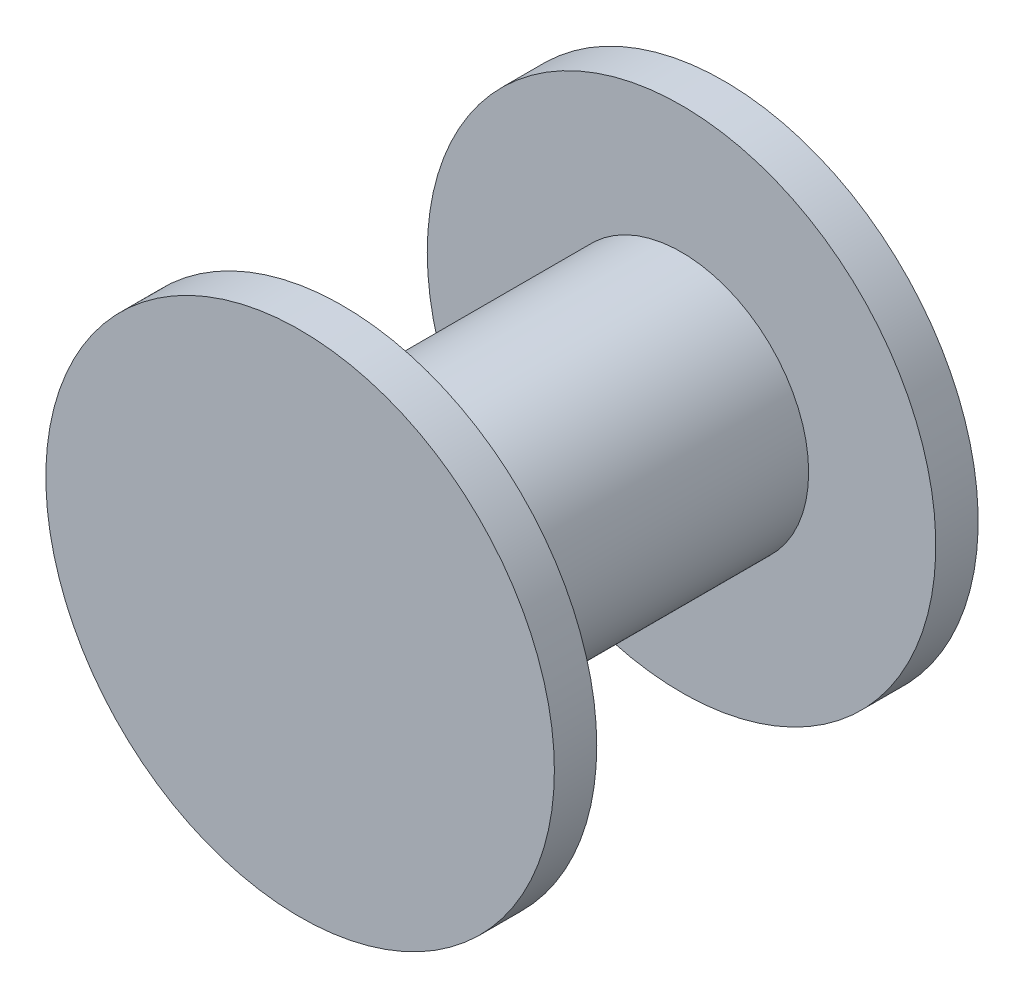
ISO-10303-21;
HEADER;
FILE_DESCRIPTION(('STEP AP214'),'2;1');
FILE_NAME('part.step','',(''),(''),'','','');
FILE_SCHEMA(('AUTOMOTIVE_DESIGN { 1 0 10303 214 1 1 1 1 }'));
ENDSEC;
DATA;
#1=APPLICATION_CONTEXT('core data for automotive mechanical design processes');
#2=APPLICATION_PROTOCOL_DEFINITION('international standard','automotive_design',2000,#1);
#3=PRODUCT_CONTEXT('',#1,'mechanical');
#4=PRODUCT('Part','Part','',(#3));
#5=PRODUCT_RELATED_PRODUCT_CATEGORY('part','',(#4));
#6=PRODUCT_DEFINITION_FORMATION('','',#4);
#7=PRODUCT_DEFINITION_CONTEXT('part definition',#1,'design');
#8=PRODUCT_DEFINITION('design','',#6,#7);
#9=PRODUCT_DEFINITION_SHAPE('','',#8);
#10=(LENGTH_UNIT() NAMED_UNIT(*) SI_UNIT(.MILLI.,.METRE.));
#11=(NAMED_UNIT(*) PLANE_ANGLE_UNIT() SI_UNIT($,.RADIAN.));
#12=(NAMED_UNIT(*) SI_UNIT($,.STERADIAN.) SOLID_ANGLE_UNIT());
#13=UNCERTAINTY_MEASURE_WITH_UNIT(LENGTH_MEASURE(1.E-05),#10,'distance_accuracy_value','');
#14=(GEOMETRIC_REPRESENTATION_CONTEXT(3) GLOBAL_UNCERTAINTY_ASSIGNED_CONTEXT((#13)) GLOBAL_UNIT_ASSIGNED_CONTEXT((#10,
#11,#12)) REPRESENTATION_CONTEXT('',''));
#15=CARTESIAN_POINT('',(0.,0.,0.));
#16=DIRECTION('',(0.,0.,1.));
#17=DIRECTION('',(1.,0.,0.));
#18=AXIS2_PLACEMENT_3D('',#15,#16,#17);
#19=CARTESIAN_POINT('',(0.,0.,25.4));
#20=DIRECTION('',(0.,0.,-1.));
#21=DIRECTION('',(-1.,0.,0.));
#22=AXIS2_PLACEMENT_3D('',#19,#20,#21);
#23=CYLINDRICAL_SURFACE('',#22,9.525);
#24=CARTESIAN_POINT('',(0.,0.,25.4));
#25=DIRECTION('',(0.,0.,1.));
#26=DIRECTION('',(1.,0.,0.));
#27=AXIS2_PLACEMENT_3D('',#24,#25,#26);
#28=CIRCLE('',#27,9.525);
#29=CARTESIAN_POINT('',(9.525,0.,25.4));
#30=VERTEX_POINT('',#29);
#31=EDGE_CURVE('E10',#30,#30,#28,.T.);
#32=ORIENTED_EDGE('',*,*,#31,.F.);
#33=EDGE_LOOP('',(#32));
#34=FACE_BOUND('',#33,.T.);
#35=CARTESIAN_POINT('',(0.,0.,0.));
#36=DIRECTION('',(0.,0.,1.));
#37=DIRECTION('',(1.,0.,0.));
#38=AXIS2_PLACEMENT_3D('',#35,#36,#37);
#39=CIRCLE('',#38,9.525);
#40=CARTESIAN_POINT('',(9.525,0.,0.));
#41=VERTEX_POINT('',#40);
#42=EDGE_CURVE('E40',#41,#41,#39,.T.);
#43=ORIENTED_EDGE('',*,*,#42,.T.);
#44=EDGE_LOOP('',(#43));
#45=FACE_BOUND('',#44,.T.);
#46=ADVANCED_FACE('F37',(#34,#45),#23,.T.);
#47=CARTESIAN_POINT('',(0.,-0.290363566424969,28.575));
#48=DIRECTION('',(0.,0.,-1.));
#49=DIRECTION('',(-1.,0.,0.));
#50=AXIS2_PLACEMENT_3D('',#47,#48,#49);
#51=CYLINDRICAL_SURFACE('',#50,19.05);
#52=CARTESIAN_POINT('',(0.,-0.290363566424969,28.575));
#53=DIRECTION('',(0.,0.,1.));
#54=DIRECTION('',(1.,0.,0.));
#55=AXIS2_PLACEMENT_3D('',#52,#53,#54);
#56=CIRCLE('',#55,19.05);
#57=CARTESIAN_POINT('',(19.05,-0.290363566424969,28.575));
#58=VERTEX_POINT('',#57);
#59=EDGE_CURVE('E45',#58,#58,#56,.T.);
#60=ORIENTED_EDGE('',*,*,#59,.F.);
#61=EDGE_LOOP('',(#60));
#62=FACE_BOUND('',#61,.T.);
#63=CARTESIAN_POINT('',(0.,-0.290363566424969,25.4));
#64=DIRECTION('',(0.,0.,1.));
#65=DIRECTION('',(1.,0.,0.));
#66=AXIS2_PLACEMENT_3D('',#63,#64,#65);
#67=CIRCLE('',#66,19.05);
#68=CARTESIAN_POINT('',(19.05,-0.290363566424969,25.4));
#69=VERTEX_POINT('',#68);
#70=EDGE_CURVE('E50',#69,#69,#67,.T.);
#71=ORIENTED_EDGE('',*,*,#70,.T.);
#72=EDGE_LOOP('',(#71));
#73=FACE_BOUND('',#72,.T.);
#74=ADVANCED_FACE('F91',(#62,#73),#51,.T.);
#75=CARTESIAN_POINT('',(0.,-0.290363566424969,28.575));
#76=DIRECTION('',(0.,0.,1.));
#77=DIRECTION('',(1.,0.,0.));
#78=AXIS2_PLACEMENT_3D('',#75,#76,#77);
#79=PLANE('',#78);
#80=ORIENTED_EDGE('',*,*,#59,.T.);
#81=EDGE_LOOP('',(#80));
#82=FACE_BOUND('',#81,.T.);
#83=ADVANCED_FACE('F87',(#82),#79,.T.);
#84=CARTESIAN_POINT('',(0.,-0.290363566424969,25.4));
#85=DIRECTION('',(0.,0.,1.));
#86=DIRECTION('',(1.,0.,0.));
#87=AXIS2_PLACEMENT_3D('',#84,#85,#86);
#88=PLANE('',#87);
#89=ORIENTED_EDGE('',*,*,#31,.T.);
#90=EDGE_LOOP('',(#89));
#91=FACE_BOUND('',#90,.T.);
#92=ORIENTED_EDGE('',*,*,#70,.F.);
#93=EDGE_LOOP('',(#92));
#94=FACE_BOUND('',#93,.T.);
#95=ADVANCED_FACE('F79',(#91,#94),#88,.F.);
#96=CARTESIAN_POINT('',(0.,0.,-3.175));
#97=DIRECTION('',(0.,0.,1.));
#98=DIRECTION('',(1.,0.,0.));
#99=AXIS2_PLACEMENT_3D('',#96,#97,#98);
#100=CYLINDRICAL_SURFACE('',#99,19.05);
#101=CARTESIAN_POINT('',(0.,0.,-3.175));
#102=DIRECTION('',(0.,0.,-1.));
#103=DIRECTION('',(-1.,0.,0.));
#104=AXIS2_PLACEMENT_3D('',#101,#102,#103);
#105=CIRCLE('',#104,19.05);
#106=CARTESIAN_POINT('',(-19.05,0.,-3.175));
#107=VERTEX_POINT('',#106);
#108=EDGE_CURVE('E60',#107,#107,#105,.T.);
#109=ORIENTED_EDGE('',*,*,#108,.F.);
#110=EDGE_LOOP('',(#109));
#111=FACE_BOUND('',#110,.T.);
#112=CARTESIAN_POINT('',(0.,0.,0.));
#113=DIRECTION('',(0.,0.,-1.));
#114=DIRECTION('',(-1.,0.,0.));
#115=AXIS2_PLACEMENT_3D('',#112,#113,#114);
#116=CIRCLE('',#115,19.05);
#117=CARTESIAN_POINT('',(-19.05,0.,0.));
#118=VERTEX_POINT('',#117);
#119=EDGE_CURVE('E56',#118,#118,#116,.T.);
#120=ORIENTED_EDGE('',*,*,#119,.T.);
#121=EDGE_LOOP('',(#120));
#122=FACE_BOUND('',#121,.T.);
#123=ADVANCED_FACE('F77',(#111,#122),#100,.T.);
#124=CARTESIAN_POINT('',(0.,0.,-3.175));
#125=DIRECTION('',(0.,0.,-1.));
#126=DIRECTION('',(-1.,0.,0.));
#127=AXIS2_PLACEMENT_3D('',#124,#125,#126);
#128=PLANE('',#127);
#129=ORIENTED_EDGE('',*,*,#108,.T.);
#130=EDGE_LOOP('',(#129));
#131=FACE_BOUND('',#130,.T.);
#132=ADVANCED_FACE('F73',(#131),#128,.T.);
#133=CARTESIAN_POINT('',(0.,0.,0.));
#134=DIRECTION('',(0.,0.,-1.));
#135=DIRECTION('',(-1.,0.,0.));
#136=AXIS2_PLACEMENT_3D('',#133,#134,#135);
#137=PLANE('',#136);
#138=ORIENTED_EDGE('',*,*,#42,.F.);
#139=EDGE_LOOP('',(#138));
#140=FACE_BOUND('',#139,.T.);
#141=ORIENTED_EDGE('',*,*,#119,.F.);
#142=EDGE_LOOP('',(#141));
#143=FACE_BOUND('',#142,.T.);
#144=ADVANCED_FACE('F70',(#140,#143),#137,.F.);
#145=CLOSED_SHELL('',(#46,#74,#83,#95,#123,#132,#144));
#146=MANIFOLD_SOLID_BREP('B2',#145);
#147=ADVANCED_BREP_SHAPE_REPRESENTATION('',(#18,#146),#14);
#148=SHAPE_DEFINITION_REPRESENTATION(#9,#147);
ENDSEC;
END-ISO-10303-21;
